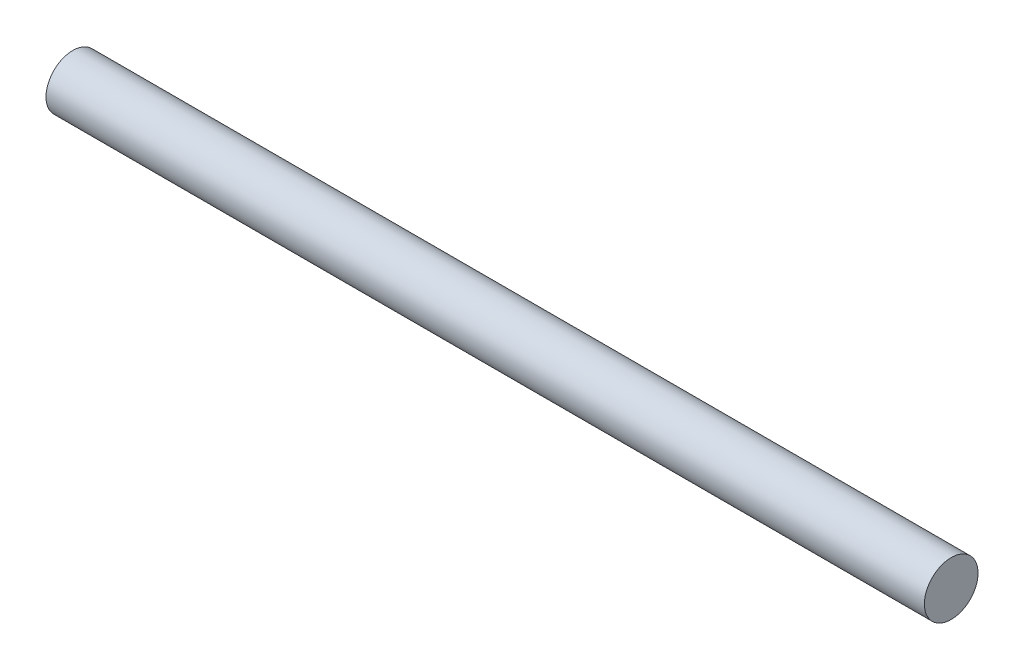
ISO-10303-21;
HEADER;
FILE_DESCRIPTION(('STEP AP214'),'2;1');
FILE_NAME('part.step','',(''),(''),'','','');
FILE_SCHEMA(('AUTOMOTIVE_DESIGN { 1 0 10303 214 1 1 1 1 }'));
ENDSEC;
DATA;
#1=APPLICATION_CONTEXT('core data for automotive mechanical design processes');
#2=APPLICATION_PROTOCOL_DEFINITION('international standard','automotive_design',2000,#1);
#3=PRODUCT_CONTEXT('',#1,'mechanical');
#4=PRODUCT('Part','Part','',(#3));
#5=PRODUCT_RELATED_PRODUCT_CATEGORY('part','',(#4));
#6=PRODUCT_DEFINITION_FORMATION('','',#4);
#7=PRODUCT_DEFINITION_CONTEXT('part definition',#1,'design');
#8=PRODUCT_DEFINITION('design','',#6,#7);
#9=PRODUCT_DEFINITION_SHAPE('','',#8);
#10=(LENGTH_UNIT() NAMED_UNIT(*) SI_UNIT(.MILLI.,.METRE.));
#11=(NAMED_UNIT(*) PLANE_ANGLE_UNIT() SI_UNIT($,.RADIAN.));
#12=(NAMED_UNIT(*) SI_UNIT($,.STERADIAN.) SOLID_ANGLE_UNIT());
#13=UNCERTAINTY_MEASURE_WITH_UNIT(LENGTH_MEASURE(1.E-05),#10,'distance_accuracy_value','');
#14=(GEOMETRIC_REPRESENTATION_CONTEXT(3) GLOBAL_UNCERTAINTY_ASSIGNED_CONTEXT((#13)) GLOBAL_UNIT_ASSIGNED_CONTEXT((#10,
#11,#12)) REPRESENTATION_CONTEXT('',''));
#15=CARTESIAN_POINT('',(0.,0.,0.));
#16=DIRECTION('',(0.,0.,1.));
#17=DIRECTION('',(1.,0.,0.));
#18=AXIS2_PLACEMENT_3D('',#15,#16,#17);
#19=CARTESIAN_POINT('',(360.,0.,0.));
#20=DIRECTION('',(-1.,0.,0.));
#21=DIRECTION('',(0.,0.,1.));
#22=AXIS2_PLACEMENT_3D('',#19,#20,#21);
#23=CYLINDRICAL_SURFACE('',#22,11.);
#24=CARTESIAN_POINT('',(360.,0.,0.));
#25=DIRECTION('',(1.,0.,0.));
#26=DIRECTION('',(0.,0.,-1.));
#27=AXIS2_PLACEMENT_3D('',#24,#25,#26);
#28=CIRCLE('',#27,11.);
#29=CARTESIAN_POINT('',(360.,0.,11.));
#30=VERTEX_POINT('',#29);
#31=EDGE_CURVE('E10',#30,#30,#28,.T.);
#32=CARTESIAN_POINT('',(0.,0.,0.));
#33=DIRECTION('',(1.,0.,0.));
#34=DIRECTION('',(0.,0.,-1.));
#35=AXIS2_PLACEMENT_3D('',#32,#33,#34);
#36=CIRCLE('',#35,11.);
#37=CARTESIAN_POINT('',(0.,0.,11.));
#38=VERTEX_POINT('',#37);
#39=EDGE_CURVE('E33',#38,#38,#36,.T.);
#40=CARTESIAN_POINT('',(360.,0.,11.));
#41=CARTESIAN_POINT('',(356.25,0.,11.));
#42=CARTESIAN_POINT('',(352.5,0.,11.));
#43=CARTESIAN_POINT('',(345.,0.,11.));
#44=CARTESIAN_POINT('',(341.25,0.,11.));
#45=CARTESIAN_POINT('',(333.75,0.,11.));
#46=CARTESIAN_POINT('',(330.,0.,11.));
#47=CARTESIAN_POINT('',(322.5,0.,11.));
#48=CARTESIAN_POINT('',(318.75,0.,11.));
#49=CARTESIAN_POINT('',(311.25,0.,11.));
#50=CARTESIAN_POINT('',(307.5,0.,11.));
#51=CARTESIAN_POINT('',(300.,0.,11.));
#52=CARTESIAN_POINT('',(296.25,0.,11.));
#53=CARTESIAN_POINT('',(288.75,0.,11.));
#54=CARTESIAN_POINT('',(285.,0.,11.));
#55=CARTESIAN_POINT('',(277.5,0.,11.));
#56=CARTESIAN_POINT('',(273.75,0.,11.));
#57=CARTESIAN_POINT('',(266.25,0.,11.));
#58=CARTESIAN_POINT('',(262.5,0.,11.));
#59=CARTESIAN_POINT('',(255.,0.,11.));
#60=CARTESIAN_POINT('',(251.25,0.,11.));
#61=CARTESIAN_POINT('',(243.75,0.,11.));
#62=CARTESIAN_POINT('',(240.,0.,11.));
#63=CARTESIAN_POINT('',(232.5,0.,11.));
#64=CARTESIAN_POINT('',(228.75,0.,11.));
#65=CARTESIAN_POINT('',(221.25,0.,11.));
#66=CARTESIAN_POINT('',(217.5,0.,11.));
#67=CARTESIAN_POINT('',(210.,0.,11.));
#68=CARTESIAN_POINT('',(206.25,0.,11.));
#69=CARTESIAN_POINT('',(198.75,0.,11.));
#70=CARTESIAN_POINT('',(195.,0.,11.));
#71=CARTESIAN_POINT('',(187.5,0.,11.));
#72=CARTESIAN_POINT('',(183.75,0.,11.));
#73=CARTESIAN_POINT('',(176.25,0.,11.));
#74=CARTESIAN_POINT('',(172.5,0.,11.));
#75=CARTESIAN_POINT('',(165.,0.,11.));
#76=CARTESIAN_POINT('',(161.25,0.,11.));
#77=CARTESIAN_POINT('',(153.75,0.,11.));
#78=CARTESIAN_POINT('',(150.,0.,11.));
#79=CARTESIAN_POINT('',(142.5,0.,11.));
#80=CARTESIAN_POINT('',(138.75,0.,11.));
#81=CARTESIAN_POINT('',(131.25,0.,11.));
#82=CARTESIAN_POINT('',(127.5,0.,11.));
#83=CARTESIAN_POINT('',(120.,0.,11.));
#84=CARTESIAN_POINT('',(116.25,0.,11.));
#85=CARTESIAN_POINT('',(108.75,0.,11.));
#86=CARTESIAN_POINT('',(105.,0.,11.));
#87=CARTESIAN_POINT('',(97.5,0.,11.));
#88=CARTESIAN_POINT('',(93.75,0.,11.));
#89=CARTESIAN_POINT('',(86.25,0.,11.));
#90=CARTESIAN_POINT('',(82.5,0.,11.));
#91=CARTESIAN_POINT('',(75.,0.,11.));
#92=CARTESIAN_POINT('',(71.25,0.,11.));
#93=CARTESIAN_POINT('',(63.75,0.,11.));
#94=CARTESIAN_POINT('',(60.,0.,11.));
#95=CARTESIAN_POINT('',(52.5,0.,11.));
#96=CARTESIAN_POINT('',(48.75,0.,11.));
#97=CARTESIAN_POINT('',(41.25,0.,11.));
#98=CARTESIAN_POINT('',(37.5,0.,11.));
#99=CARTESIAN_POINT('',(30.,0.,11.));
#100=CARTESIAN_POINT('',(26.25,0.,11.));
#101=CARTESIAN_POINT('',(18.75,0.,11.));
#102=CARTESIAN_POINT('',(14.9999999999999,0.,11.));
#103=CARTESIAN_POINT('',(7.49999999999993,0.,11.));
#104=CARTESIAN_POINT('',(3.74999999999994,0.,11.));
#105=CARTESIAN_POINT('',(0.,0.,11.));
#106=B_SPLINE_CURVE_WITH_KNOTS('',3,(#40,#41,#42,#43,#44,#45,#46,#47,#48,#49,#50,#51,#52,#53,
#54,#55,#56,#57,#58,#59,#60,#61,#62,#63,#64,#65,#66,#67,#68,#69,#70,#71,#72,#73,#74,#75,#76,#77,
#78,#79,#80,#81,#82,#83,#84,#85,#86,#87,#88,#89,#90,#91,#92,#93,#94,#95,#96,#97,#98,#99,#100,
#101,#102,#103,#104,#105),.UNSPECIFIED.,.F.,.F.,(4,2,2,2,2,2,2,2,2,2,2,2,2,2,2,2,2,2,2,2,2,2,2,
2,2,2,2,2,2,2,2,2,4),(0.,11.25,22.5,33.7500000000001,45.,56.25,67.5,78.75,90.,101.25,112.5,
123.75,135.,146.25,157.5,168.75,180.,191.25,202.5,213.75,225.,236.25,247.5,258.75,270.,281.25,
292.5,303.75,315.,326.25,337.5,348.75,360.),.UNSPECIFIED.);
#107=EDGE_CURVE('BSEAM30',#30,#38,#106,.T.);
#108=ORIENTED_EDGE('',*,*,#31,.F.);
#109=ORIENTED_EDGE('',*,*,#39,.T.);
#110=ORIENTED_EDGE('',*,*,#107,.T.);
#111=ORIENTED_EDGE('',*,*,#107,.F.);
#112=EDGE_LOOP('',(#108,#110,#109,#111));
#113=FACE_BOUND('',#112,.T.);
#114=ADVANCED_FACE('F30',(#113),#23,.T.);
#115=CARTESIAN_POINT('',(360.,0.,0.));
#116=DIRECTION('',(1.,0.,0.));
#117=DIRECTION('',(0.,0.,-1.));
#118=AXIS2_PLACEMENT_3D('',#115,#116,#117);
#119=PLANE('',#118);
#120=ORIENTED_EDGE('',*,*,#31,.T.);
#121=EDGE_LOOP('',(#120));
#122=FACE_BOUND('',#121,.T.);
#123=ADVANCED_FACE('F45',(#122),#119,.T.);
#124=CARTESIAN_POINT('',(0.,0.,0.));
#125=DIRECTION('',(1.,0.,0.));
#126=DIRECTION('',(0.,0.,-1.));
#127=AXIS2_PLACEMENT_3D('',#124,#125,#126);
#128=PLANE('',#127);
#129=ORIENTED_EDGE('',*,*,#39,.F.);
#130=EDGE_LOOP('',(#129));
#131=FACE_BOUND('',#130,.T.);
#132=ADVANCED_FACE('F43',(#131),#128,.F.);
#133=CLOSED_SHELL('',(#114,#123,#132));
#134=MANIFOLD_SOLID_BREP('B2',#133);
#135=ADVANCED_BREP_SHAPE_REPRESENTATION('',(#18,#134),#14);
#136=SHAPE_DEFINITION_REPRESENTATION(#9,#135);
ENDSEC;
END-ISO-10303-21;
